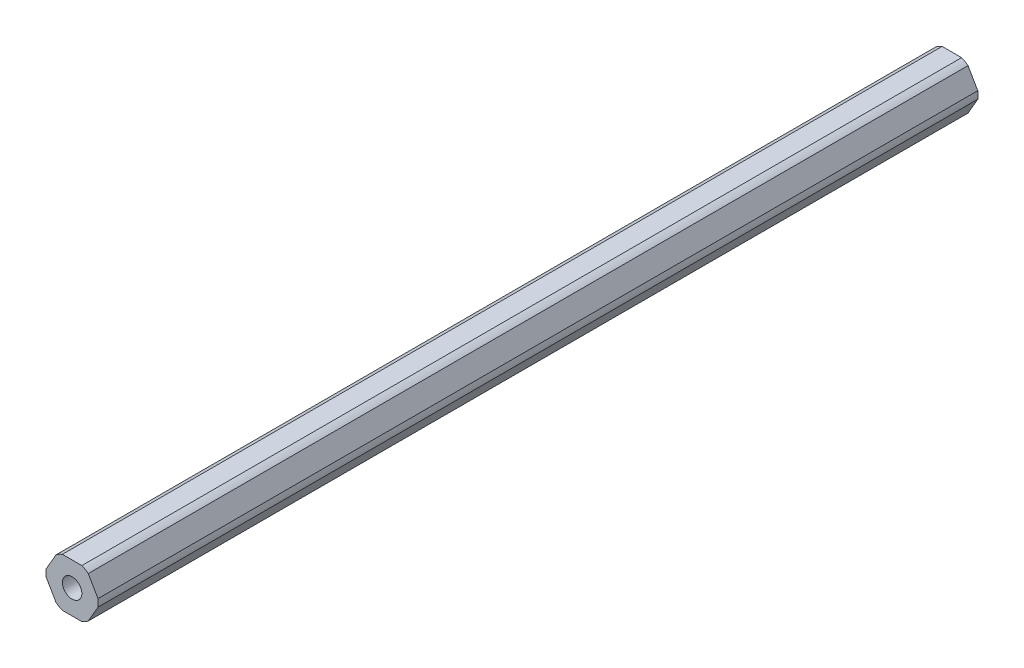
ISO-10303-21;
HEADER;
FILE_DESCRIPTION(('STEP AP214'),'2;1');
FILE_NAME('part.step','',(''),(''),'','','');
FILE_SCHEMA(('AUTOMOTIVE_DESIGN { 1 0 10303 214 1 1 1 1 }'));
ENDSEC;
DATA;
#1=APPLICATION_CONTEXT('core data for automotive mechanical design processes');
#2=APPLICATION_PROTOCOL_DEFINITION('international standard','automotive_design',2000,#1);
#3=PRODUCT_CONTEXT('',#1,'mechanical');
#4=PRODUCT('Part','Part','',(#3));
#5=PRODUCT_RELATED_PRODUCT_CATEGORY('part','',(#4));
#6=PRODUCT_DEFINITION_FORMATION('','',#4);
#7=PRODUCT_DEFINITION_CONTEXT('part definition',#1,'design');
#8=PRODUCT_DEFINITION('design','',#6,#7);
#9=PRODUCT_DEFINITION_SHAPE('','',#8);
#10=(LENGTH_UNIT() NAMED_UNIT(*) SI_UNIT(.MILLI.,.METRE.));
#11=(NAMED_UNIT(*) PLANE_ANGLE_UNIT() SI_UNIT($,.RADIAN.));
#12=(NAMED_UNIT(*) SI_UNIT($,.STERADIAN.) SOLID_ANGLE_UNIT());
#13=UNCERTAINTY_MEASURE_WITH_UNIT(LENGTH_MEASURE(1.E-05),#10,'distance_accuracy_value','');
#14=(GEOMETRIC_REPRESENTATION_CONTEXT(3) GLOBAL_UNCERTAINTY_ASSIGNED_CONTEXT((#13)) GLOBAL_UNIT_ASSIGNED_CONTEXT((#10,
#11,#12)) REPRESENTATION_CONTEXT('',''));
#15=CARTESIAN_POINT('',(0.,0.,0.));
#16=DIRECTION('',(0.,0.,1.));
#17=DIRECTION('',(1.,0.,0.));
#18=AXIS2_PLACEMENT_3D('',#15,#16,#17);
#19=CARTESIAN_POINT('',(0.,0.,-457.2));
#20=DIRECTION('',(0.,0.,1.));
#21=DIRECTION('',(1.,0.,0.));
#22=AXIS2_PLACEMENT_3D('',#19,#20,#21);
#23=CYLINDRICAL_SURFACE('',#22,6.87);
#24=CARTESIAN_POINT('',(0.,0.,226.06));
#25=DIRECTION('',(0.,0.,1.));
#26=DIRECTION('',(1.,0.,0.));
#27=AXIS2_PLACEMENT_3D('',#24,#25,#26);
#28=CIRCLE('',#27,6.87);
#29=CARTESIAN_POINT('',(6.80102150534208,0.97108520937895,226.06));
#30=VERTEX_POINT('',#29);
#31=CARTESIAN_POINT('',(6.80102150534208,-0.971085209378955,226.06));
#32=VERTEX_POINT('',#31);
#33=EDGE_CURVE('E191',#30,#32,#28,.F.);
#34=ORIENTED_EDGE('',*,*,#33,.F.);
#35=DIRECTION('',(0.,0.,1.));
#36=VECTOR('',#35,1.);
#37=CARTESIAN_POINT('',(6.80102150534208,0.97108520937895,457.2));
#38=LINE('',#37,#36);
#39=CARTESIAN_POINT('',(6.80102150534208,0.971085209378948,457.2));
#40=VERTEX_POINT('',#39);
#41=EDGE_CURVE('E171',#30,#40,#38,.T.);
#42=ORIENTED_EDGE('',*,*,#41,.T.);
#43=CARTESIAN_POINT('',(0.,0.,457.2));
#44=DIRECTION('',(0.,0.,1.));
#45=DIRECTION('',(1.,0.,0.));
#46=AXIS2_PLACEMENT_3D('',#43,#44,#45);
#47=CIRCLE('',#46,6.87);
#48=CARTESIAN_POINT('',(6.80102150534208,-0.971085209378954,457.2));
#49=VERTEX_POINT('',#48);
#50=EDGE_CURVE('E220',#40,#49,#47,.F.);
#51=ORIENTED_EDGE('',*,*,#50,.T.);
#52=DIRECTION('',(0.,0.,1.));
#53=VECTOR('',#52,1.);
#54=CARTESIAN_POINT('',(6.80102150534208,-0.971085209378955,457.2));
#55=LINE('',#54,#53);
#56=EDGE_CURVE('E250',#49,#32,#55,.F.);
#57=ORIENTED_EDGE('',*,*,#56,.T.);
#58=EDGE_LOOP('',(#34,#42,#51,#57));
#59=FACE_BOUND('',#58,.T.);
#60=ADVANCED_FACE('F43',(#59),#23,.T.);
#61=CARTESIAN_POINT('',(3.68083890619154,6.3754,457.2));
#62=DIRECTION('',(0.,-1.,0.));
#63=DIRECTION('',(1.,0.,0.));
#64=AXIS2_PLACEMENT_3D('',#61,#62,#63);
#65=PLANE('',#64);
#66=DIRECTION('',(0.,0.,1.));
#67=VECTOR('',#66,1.);
#68=CARTESIAN_POINT('',(2.55952629210953,6.37540000000001,-457.2));
#69=LINE('',#68,#67);
#70=CARTESIAN_POINT('',(2.55952629210953,6.37540000000001,226.06));
#71=VERTEX_POINT('',#70);
#72=CARTESIAN_POINT('',(2.55952629210953,6.37540000000001,457.2));
#73=VERTEX_POINT('',#72);
#74=EDGE_CURVE('E170',#71,#73,#69,.T.);
#75=ORIENTED_EDGE('',*,*,#74,.F.);
#76=DIRECTION('',(-1.,0.,0.));
#77=VECTOR('',#76,1.);
#78=CARTESIAN_POINT('',(3.68083890619154,6.3754,226.06));
#79=LINE('',#78,#77);
#80=CARTESIAN_POINT('',(-2.55952629210953,6.37540000000001,226.06));
#81=VERTEX_POINT('',#80);
#82=EDGE_CURVE('E63',#71,#81,#79,.T.);
#83=ORIENTED_EDGE('',*,*,#82,.T.);
#84=DIRECTION('',(0.,0.,1.));
#85=VECTOR('',#84,1.);
#86=CARTESIAN_POINT('',(-2.55952629210953,6.37540000000001,-457.2));
#87=LINE('',#86,#85);
#88=CARTESIAN_POINT('',(-2.55952629210953,6.37540000000001,457.2));
#89=VERTEX_POINT('',#88);
#90=EDGE_CURVE('E275',#89,#81,#87,.F.);
#91=ORIENTED_EDGE('',*,*,#90,.F.);
#92=DIRECTION('',(1.,0.,0.));
#93=VECTOR('',#92,1.);
#94=CARTESIAN_POINT('',(0.,6.3754,457.2));
#95=LINE('',#94,#93);
#96=EDGE_CURVE('E237',#73,#89,#95,.F.);
#97=ORIENTED_EDGE('',*,*,#96,.F.);
#98=EDGE_LOOP('',(#75,#83,#91,#97));
#99=FACE_BOUND('',#98,.T.);
#100=ADVANCED_FACE('F331',(#99),#65,.F.);
#101=CARTESIAN_POINT('',(0.,0.,-457.2));
#102=DIRECTION('',(0.,0.,1.));
#103=DIRECTION('',(1.,0.,0.));
#104=AXIS2_PLACEMENT_3D('',#101,#102,#103);
#105=CYLINDRICAL_SURFACE('',#104,6.87);
#106=CARTESIAN_POINT('',(0.,0.,226.06));
#107=DIRECTION('',(0.,0.,1.));
#108=DIRECTION('',(1.,0.,0.));
#109=AXIS2_PLACEMENT_3D('',#106,#107,#108);
#110=CIRCLE('',#109,6.87);
#111=CARTESIAN_POINT('',(-4.24149521323255,5.40431479062104,226.06));
#112=VERTEX_POINT('',#111);
#113=EDGE_CURVE('E71',#112,#81,#110,.F.);
#114=ORIENTED_EDGE('',*,*,#113,.F.);
#115=DIRECTION('',(0.,0.,1.));
#116=VECTOR('',#115,1.);
#117=CARTESIAN_POINT('',(-4.24149521323255,5.40431479062104,457.2));
#118=LINE('',#117,#116);
#119=CARTESIAN_POINT('',(-4.24149521323255,5.40431479062105,457.2));
#120=VERTEX_POINT('',#119);
#121=EDGE_CURVE('E272',#112,#120,#118,.T.);
#122=ORIENTED_EDGE('',*,*,#121,.T.);
#123=CARTESIAN_POINT('',(0.,0.,457.2));
#124=DIRECTION('',(0.,0.,1.));
#125=DIRECTION('',(1.,0.,0.));
#126=AXIS2_PLACEMENT_3D('',#123,#124,#125);
#127=CIRCLE('',#126,6.87);
#128=EDGE_CURVE('E236',#89,#120,#127,.T.);
#129=ORIENTED_EDGE('',*,*,#128,.F.);
#130=ORIENTED_EDGE('',*,*,#90,.T.);
#131=EDGE_LOOP('',(#114,#122,#129,#130));
#132=FACE_BOUND('',#131,.T.);
#133=ADVANCED_FACE('F329',(#132),#105,.T.);
#134=CARTESIAN_POINT('',(-3.68083890619154,6.3754,457.2));
#135=DIRECTION('',(0.866025403784439,-0.5,0.));
#136=DIRECTION('',(0.5,0.866025403784439,0.));
#137=AXIS2_PLACEMENT_3D('',#134,#135,#136);
#138=PLANE('',#137);
#139=ORIENTED_EDGE('',*,*,#121,.F.);
#140=DIRECTION('',(-0.5,-0.866025403784439,0.));
#141=VECTOR('',#140,1.);
#142=CARTESIAN_POINT('',(-3.68083890619154,6.3754,226.06));
#143=LINE('',#142,#141);
#144=CARTESIAN_POINT('',(-6.80102150534208,0.971085209378959,226.06));
#145=VERTEX_POINT('',#144);
#146=EDGE_CURVE('E215',#112,#145,#143,.T.);
#147=ORIENTED_EDGE('',*,*,#146,.T.);
#148=DIRECTION('',(0.,0.,1.));
#149=VECTOR('',#148,1.);
#150=CARTESIAN_POINT('',(-6.80102150534208,0.971085209378959,-457.2));
#151=LINE('',#150,#149);
#152=CARTESIAN_POINT('',(-6.80102150534208,0.971085209378961,457.2));
#153=VERTEX_POINT('',#152);
#154=EDGE_CURVE('E268',#153,#145,#151,.F.);
#155=ORIENTED_EDGE('',*,*,#154,.F.);
#156=DIRECTION('',(-0.5,-0.866025403784439,0.));
#157=VECTOR('',#156,1.);
#158=CARTESIAN_POINT('',(-4.24149521323255,5.40431479062104,457.2));
#159=LINE('',#158,#157);
#160=EDGE_CURVE('E233',#120,#153,#159,.T.);
#161=ORIENTED_EDGE('',*,*,#160,.F.);
#162=EDGE_LOOP('',(#139,#147,#155,#161));
#163=FACE_BOUND('',#162,.T.);
#164=ADVANCED_FACE('F327',(#163),#138,.F.);
#165=CARTESIAN_POINT('',(0.,0.,-457.2));
#166=DIRECTION('',(0.,0.,1.));
#167=DIRECTION('',(1.,0.,0.));
#168=AXIS2_PLACEMENT_3D('',#165,#166,#167);
#169=CYLINDRICAL_SURFACE('',#168,6.87);
#170=CARTESIAN_POINT('',(0.,0.,226.06));
#171=DIRECTION('',(0.,0.,1.));
#172=DIRECTION('',(1.,0.,0.));
#173=AXIS2_PLACEMENT_3D('',#170,#171,#172);
#174=CIRCLE('',#173,6.87);
#175=CARTESIAN_POINT('',(-6.80102150534208,-0.971085209378956,226.06));
#176=VERTEX_POINT('',#175);
#177=EDGE_CURVE('E211',#176,#145,#174,.F.);
#178=ORIENTED_EDGE('',*,*,#177,.F.);
#179=DIRECTION('',(0.,0.,1.));
#180=VECTOR('',#179,1.);
#181=CARTESIAN_POINT('',(-6.80102150534208,-0.971085209378956,457.2));
#182=LINE('',#181,#180);
#183=CARTESIAN_POINT('',(-6.80102150534208,-0.971085209378955,457.2));
#184=VERTEX_POINT('',#183);
#185=EDGE_CURVE('E265',#176,#184,#182,.T.);
#186=ORIENTED_EDGE('',*,*,#185,.T.);
#187=CARTESIAN_POINT('',(0.,0.,457.2));
#188=DIRECTION('',(0.,0.,1.));
#189=DIRECTION('',(1.,0.,0.));
#190=AXIS2_PLACEMENT_3D('',#187,#188,#189);
#191=CIRCLE('',#190,6.87);
#192=EDGE_CURVE('E232',#153,#184,#191,.T.);
#193=ORIENTED_EDGE('',*,*,#192,.F.);
#194=ORIENTED_EDGE('',*,*,#154,.T.);
#195=EDGE_LOOP('',(#178,#186,#193,#194));
#196=FACE_BOUND('',#195,.T.);
#197=ADVANCED_FACE('F323',(#196),#169,.T.);
#198=CARTESIAN_POINT('',(-7.36167781238308,0.,457.2));
#199=DIRECTION('',(0.866025403784439,0.5,0.));
#200=DIRECTION('',(-0.5,0.866025403784439,0.));
#201=AXIS2_PLACEMENT_3D('',#198,#199,#200);
#202=PLANE('',#201);
#203=ORIENTED_EDGE('',*,*,#185,.F.);
#204=DIRECTION('',(0.5,-0.866025403784439,0.));
#205=VECTOR('',#204,1.);
#206=CARTESIAN_POINT('',(-7.36167781238308,0.,226.06));
#207=LINE('',#206,#205);
#208=CARTESIAN_POINT('',(-4.24149521323255,-5.40431479062105,226.06));
#209=VERTEX_POINT('',#208);
#210=EDGE_CURVE('E208',#176,#209,#207,.T.);
#211=ORIENTED_EDGE('',*,*,#210,.T.);
#212=DIRECTION('',(0.,0.,1.));
#213=VECTOR('',#212,1.);
#214=CARTESIAN_POINT('',(-4.24149521323255,-5.40431479062105,-457.2));
#215=LINE('',#214,#213);
#216=CARTESIAN_POINT('',(-4.24149521323255,-5.40431479062105,457.2));
#217=VERTEX_POINT('',#216);
#218=EDGE_CURVE('E261',#217,#209,#215,.F.);
#219=ORIENTED_EDGE('',*,*,#218,.F.);
#220=DIRECTION('',(0.5,-0.866025403784439,0.));
#221=VECTOR('',#220,1.);
#222=CARTESIAN_POINT('',(-6.80102150534208,-0.971085209378956,457.2));
#223=LINE('',#222,#221);
#224=EDGE_CURVE('E229',#184,#217,#223,.T.);
#225=ORIENTED_EDGE('',*,*,#224,.F.);
#226=EDGE_LOOP('',(#203,#211,#219,#225));
#227=FACE_BOUND('',#226,.T.);
#228=ADVANCED_FACE('F321',(#227),#202,.F.);
#229=CARTESIAN_POINT('',(0.,0.,-457.2));
#230=DIRECTION('',(0.,0.,1.));
#231=DIRECTION('',(1.,0.,0.));
#232=AXIS2_PLACEMENT_3D('',#229,#230,#231);
#233=CYLINDRICAL_SURFACE('',#232,6.87);
#234=CARTESIAN_POINT('',(0.,0.,226.06));
#235=DIRECTION('',(0.,0.,1.));
#236=DIRECTION('',(1.,0.,0.));
#237=AXIS2_PLACEMENT_3D('',#234,#235,#236);
#238=CIRCLE('',#237,6.87);
#239=CARTESIAN_POINT('',(-2.55952629210953,-6.3754,226.06));
#240=VERTEX_POINT('',#239);
#241=EDGE_CURVE('E204',#240,#209,#238,.F.);
#242=ORIENTED_EDGE('',*,*,#241,.F.);
#243=DIRECTION('',(0.,0.,1.));
#244=VECTOR('',#243,1.);
#245=CARTESIAN_POINT('',(-2.55952629210953,-6.3754,457.2));
#246=LINE('',#245,#244);
#247=CARTESIAN_POINT('',(-2.55952629210953,-6.3754,457.2));
#248=VERTEX_POINT('',#247);
#249=EDGE_CURVE('E258',#240,#248,#246,.T.);
#250=ORIENTED_EDGE('',*,*,#249,.T.);
#251=CARTESIAN_POINT('',(0.,0.,457.2));
#252=DIRECTION('',(0.,0.,1.));
#253=DIRECTION('',(1.,0.,0.));
#254=AXIS2_PLACEMENT_3D('',#251,#252,#253);
#255=CIRCLE('',#254,6.87);
#256=EDGE_CURVE('E228',#217,#248,#255,.T.);
#257=ORIENTED_EDGE('',*,*,#256,.F.);
#258=ORIENTED_EDGE('',*,*,#218,.T.);
#259=EDGE_LOOP('',(#242,#250,#257,#258));
#260=FACE_BOUND('',#259,.T.);
#261=ADVANCED_FACE('F315',(#260),#233,.T.);
#262=CARTESIAN_POINT('',(-3.68083890619154,-6.3754,457.2));
#263=DIRECTION('',(0.,1.,0.));
#264=DIRECTION('',(0.,0.,1.));
#265=AXIS2_PLACEMENT_3D('',#262,#263,#264);
#266=PLANE('',#265);
#267=ORIENTED_EDGE('',*,*,#249,.F.);
#268=DIRECTION('',(1.,0.,0.));
#269=VECTOR('',#268,1.);
#270=CARTESIAN_POINT('',(-3.68083890619154,-6.3754,226.06));
#271=LINE('',#270,#269);
#272=CARTESIAN_POINT('',(2.55952629210953,-6.3754,226.06));
#273=VERTEX_POINT('',#272);
#274=EDGE_CURVE('E201',#240,#273,#271,.T.);
#275=ORIENTED_EDGE('',*,*,#274,.T.);
#276=DIRECTION('',(0.,0.,1.));
#277=VECTOR('',#276,1.);
#278=CARTESIAN_POINT('',(2.55952629210953,-6.3754,-457.2));
#279=LINE('',#278,#277);
#280=CARTESIAN_POINT('',(2.55952629210953,-6.3754,457.2));
#281=VERTEX_POINT('',#280);
#282=EDGE_CURVE('E254',#281,#273,#279,.F.);
#283=ORIENTED_EDGE('',*,*,#282,.F.);
#284=DIRECTION('',(1.,0.,0.));
#285=VECTOR('',#284,1.);
#286=CARTESIAN_POINT('',(0.,-6.3754,457.2));
#287=LINE('',#286,#285);
#288=EDGE_CURVE('E225',#248,#281,#287,.T.);
#289=ORIENTED_EDGE('',*,*,#288,.F.);
#290=EDGE_LOOP('',(#267,#275,#283,#289));
#291=FACE_BOUND('',#290,.T.);
#292=ADVANCED_FACE('F312',(#291),#266,.F.);
#293=CARTESIAN_POINT('',(0.,0.,-457.2));
#294=DIRECTION('',(0.,0.,1.));
#295=DIRECTION('',(1.,0.,0.));
#296=AXIS2_PLACEMENT_3D('',#293,#294,#295);
#297=CYLINDRICAL_SURFACE('',#296,6.87);
#298=CARTESIAN_POINT('',(0.,0.,226.06));
#299=DIRECTION('',(0.,0.,1.));
#300=DIRECTION('',(1.,0.,0.));
#301=AXIS2_PLACEMENT_3D('',#298,#299,#300);
#302=CIRCLE('',#301,6.87);
#303=CARTESIAN_POINT('',(4.24149521323254,-5.40431479062105,226.06));
#304=VERTEX_POINT('',#303);
#305=EDGE_CURVE('E197',#304,#273,#302,.F.);
#306=ORIENTED_EDGE('',*,*,#305,.F.);
#307=DIRECTION('',(0.,0.,1.));
#308=VECTOR('',#307,1.);
#309=CARTESIAN_POINT('',(4.24149521323254,-5.40431479062105,457.2));
#310=LINE('',#309,#308);
#311=CARTESIAN_POINT('',(4.24149521323254,-5.40431479062105,457.2));
#312=VERTEX_POINT('',#311);
#313=EDGE_CURVE('E247',#304,#312,#310,.T.);
#314=ORIENTED_EDGE('',*,*,#313,.T.);
#315=CARTESIAN_POINT('',(0.,0.,457.2));
#316=DIRECTION('',(0.,0.,1.));
#317=DIRECTION('',(1.,0.,0.));
#318=AXIS2_PLACEMENT_3D('',#315,#316,#317);
#319=CIRCLE('',#318,6.87);
#320=EDGE_CURVE('E224',#281,#312,#319,.T.);
#321=ORIENTED_EDGE('',*,*,#320,.F.);
#322=ORIENTED_EDGE('',*,*,#282,.T.);
#323=EDGE_LOOP('',(#306,#314,#321,#322));
#324=FACE_BOUND('',#323,.T.);
#325=ADVANCED_FACE('F307',(#324),#297,.T.);
#326=CARTESIAN_POINT('',(3.68083890619154,-6.3754,457.2));
#327=DIRECTION('',(-0.866025403784439,0.5,0.));
#328=DIRECTION('',(-0.5,-0.866025403784439,0.));
#329=AXIS2_PLACEMENT_3D('',#326,#327,#328);
#330=PLANE('',#329);
#331=ORIENTED_EDGE('',*,*,#313,.F.);
#332=DIRECTION('',(0.5,0.866025403784439,0.));
#333=VECTOR('',#332,1.);
#334=CARTESIAN_POINT('',(3.68083890619154,-6.3754,226.06));
#335=LINE('',#334,#333);
#336=EDGE_CURVE('E194',#304,#32,#335,.T.);
#337=ORIENTED_EDGE('',*,*,#336,.T.);
#338=ORIENTED_EDGE('',*,*,#56,.F.);
#339=DIRECTION('',(0.5,0.866025403784439,0.));
#340=VECTOR('',#339,1.);
#341=CARTESIAN_POINT('',(4.24149521323254,-5.40431479062105,457.2));
#342=LINE('',#341,#340);
#343=EDGE_CURVE('E52',#312,#49,#342,.T.);
#344=ORIENTED_EDGE('',*,*,#343,.F.);
#345=EDGE_LOOP('',(#331,#337,#338,#344));
#346=FACE_BOUND('',#345,.T.);
#347=ADVANCED_FACE('F299',(#346),#330,.F.);
#348=CARTESIAN_POINT('',(7.36167781238308,0.,457.2));
#349=DIRECTION('',(-0.866025403784439,-0.5,0.));
#350=DIRECTION('',(0.5,-0.866025403784439,0.));
#351=AXIS2_PLACEMENT_3D('',#348,#349,#350);
#352=PLANE('',#351);
#353=ORIENTED_EDGE('',*,*,#41,.F.);
#354=DIRECTION('',(-0.5,0.866025403784439,0.));
#355=VECTOR('',#354,1.);
#356=CARTESIAN_POINT('',(7.36167781238308,0.,226.06));
#357=LINE('',#356,#355);
#358=CARTESIAN_POINT('',(4.24149521323254,5.40431479062105,226.06));
#359=VERTEX_POINT('',#358);
#360=EDGE_CURVE('E175',#30,#359,#357,.T.);
#361=ORIENTED_EDGE('',*,*,#360,.T.);
#362=DIRECTION('',(0.,0.,1.));
#363=VECTOR('',#362,1.);
#364=CARTESIAN_POINT('',(4.24149521323254,5.40431479062105,-457.2));
#365=LINE('',#364,#363);
#366=CARTESIAN_POINT('',(4.24149521323254,5.40431479062105,457.2));
#367=VERTEX_POINT('',#366);
#368=EDGE_CURVE('E160',#367,#359,#365,.F.);
#369=ORIENTED_EDGE('',*,*,#368,.F.);
#370=DIRECTION('',(-0.5,0.866025403784438,0.));
#371=VECTOR('',#370,1.);
#372=CARTESIAN_POINT('',(6.80102150534208,0.97108520937895,457.2));
#373=LINE('',#372,#371);
#374=EDGE_CURVE('E240',#40,#367,#373,.T.);
#375=ORIENTED_EDGE('',*,*,#374,.F.);
#376=EDGE_LOOP('',(#353,#361,#369,#375));
#377=FACE_BOUND('',#376,.T.);
#378=ADVANCED_FACE('F176',(#377),#352,.F.);
#379=CARTESIAN_POINT('',(0.,0.,-457.2));
#380=DIRECTION('',(0.,0.,1.));
#381=DIRECTION('',(1.,0.,0.));
#382=AXIS2_PLACEMENT_3D('',#379,#380,#381);
#383=CYLINDRICAL_SURFACE('',#382,6.87);
#384=CARTESIAN_POINT('',(0.,0.,226.06));
#385=DIRECTION('',(0.,0.,1.));
#386=DIRECTION('',(1.,0.,0.));
#387=AXIS2_PLACEMENT_3D('',#384,#385,#386);
#388=CIRCLE('',#387,6.87);
#389=EDGE_CURVE('E164',#71,#359,#388,.F.);
#390=ORIENTED_EDGE('',*,*,#389,.F.);
#391=ORIENTED_EDGE('',*,*,#74,.T.);
#392=CARTESIAN_POINT('',(0.,0.,457.2));
#393=DIRECTION('',(0.,0.,1.));
#394=DIRECTION('',(1.,0.,0.));
#395=AXIS2_PLACEMENT_3D('',#392,#393,#394);
#396=CIRCLE('',#395,6.87);
#397=EDGE_CURVE('E166',#367,#73,#396,.T.);
#398=ORIENTED_EDGE('',*,*,#397,.F.);
#399=ORIENTED_EDGE('',*,*,#368,.T.);
#400=EDGE_LOOP('',(#390,#391,#398,#399));
#401=FACE_BOUND('',#400,.T.);
#402=ADVANCED_FACE('F162',(#401),#383,.T.);
#403=CARTESIAN_POINT('',(0.,0.,457.2));
#404=DIRECTION('',(0.,0.,1.));
#405=DIRECTION('',(1.,0.,0.));
#406=AXIS2_PLACEMENT_3D('',#403,#404,#405);
#407=PLANE('',#406);
#408=ORIENTED_EDGE('',*,*,#343,.T.);
#409=ORIENTED_EDGE('',*,*,#50,.F.);
#410=ORIENTED_EDGE('',*,*,#374,.T.);
#411=ORIENTED_EDGE('',*,*,#397,.T.);
#412=ORIENTED_EDGE('',*,*,#96,.T.);
#413=ORIENTED_EDGE('',*,*,#128,.T.);
#414=ORIENTED_EDGE('',*,*,#160,.T.);
#415=ORIENTED_EDGE('',*,*,#192,.T.);
#416=ORIENTED_EDGE('',*,*,#224,.T.);
#417=ORIENTED_EDGE('',*,*,#256,.T.);
#418=ORIENTED_EDGE('',*,*,#288,.T.);
#419=ORIENTED_EDGE('',*,*,#320,.T.);
#420=EDGE_LOOP('',(#408,#409,#410,#411,#412,#413,#414,#415,#416,#417,#418,#419));
#421=FACE_BOUND('',#420,.T.);
#422=CARTESIAN_POINT('',(0.,0.,457.2));
#423=DIRECTION('',(0.,0.,1.));
#424=DIRECTION('',(1.,0.,0.));
#425=AXIS2_PLACEMENT_3D('',#422,#423,#424);
#426=CIRCLE('',#425,2.55);
#427=CARTESIAN_POINT('',(2.55,0.,457.2));
#428=VERTEX_POINT('',#427);
#429=EDGE_CURVE('E12',#428,#428,#426,.F.);
#430=ORIENTED_EDGE('',*,*,#429,.T.);
#431=EDGE_LOOP('',(#430));
#432=FACE_BOUND('',#431,.T.);
#433=ADVANCED_FACE('F301',(#421,#432),#407,.T.);
#434=CARTESIAN_POINT('',(0.,0.,-457.2));
#435=DIRECTION('',(0.,0.,1.));
#436=DIRECTION('',(1.,0.,0.));
#437=AXIS2_PLACEMENT_3D('',#434,#435,#436);
#438=CYLINDRICAL_SURFACE('',#437,2.55);
#439=CARTESIAN_POINT('',(0.,0.,226.06));
#440=DIRECTION('',(0.,0.,1.));
#441=DIRECTION('',(1.,0.,0.));
#442=AXIS2_PLACEMENT_3D('',#439,#440,#441);
#443=CIRCLE('',#442,2.55);
#444=CARTESIAN_POINT('',(2.55,0.,226.06));
#445=VERTEX_POINT('',#444);
#446=EDGE_CURVE('E46',#445,#445,#443,.F.);
#447=ORIENTED_EDGE('',*,*,#446,.T.);
#448=EDGE_LOOP('',(#447));
#449=FACE_BOUND('',#448,.T.);
#450=ORIENTED_EDGE('',*,*,#429,.F.);
#451=EDGE_LOOP('',(#450));
#452=FACE_BOUND('',#451,.T.);
#453=ADVANCED_FACE('F338',(#449,#452),#438,.F.);
#454=CARTESIAN_POINT('',(0.,0.,226.06));
#455=DIRECTION('',(0.,0.,1.));
#456=DIRECTION('',(1.,0.,0.));
#457=AXIS2_PLACEMENT_3D('',#454,#455,#456);
#458=PLANE('',#457);
#459=ORIENTED_EDGE('',*,*,#146,.F.);
#460=ORIENTED_EDGE('',*,*,#113,.T.);
#461=ORIENTED_EDGE('',*,*,#82,.F.);
#462=ORIENTED_EDGE('',*,*,#389,.T.);
#463=ORIENTED_EDGE('',*,*,#360,.F.);
#464=ORIENTED_EDGE('',*,*,#33,.T.);
#465=ORIENTED_EDGE('',*,*,#336,.F.);
#466=ORIENTED_EDGE('',*,*,#305,.T.);
#467=ORIENTED_EDGE('',*,*,#274,.F.);
#468=ORIENTED_EDGE('',*,*,#241,.T.);
#469=ORIENTED_EDGE('',*,*,#210,.F.);
#470=ORIENTED_EDGE('',*,*,#177,.T.);
#471=EDGE_LOOP('',(#459,#460,#461,#462,#463,#464,#465,#466,#467,#468,#469,#470));
#472=FACE_BOUND('',#471,.T.);
#473=ORIENTED_EDGE('',*,*,#446,.F.);
#474=EDGE_LOOP('',(#473));
#475=FACE_BOUND('',#474,.T.);
#476=ADVANCED_FACE('F182',(#472,#475),#458,.F.);
#477=CLOSED_SHELL('',(#60,#100,#133,#164,#197,#228,#261,#292,#325,#347,#378,#402,#433,#453,#476));
#478=MANIFOLD_SOLID_BREP('B2',#477);
#479=ADVANCED_BREP_SHAPE_REPRESENTATION('',(#18,#478),#14);
#480=SHAPE_DEFINITION_REPRESENTATION(#9,#479);
ENDSEC;
END-ISO-10303-21;
